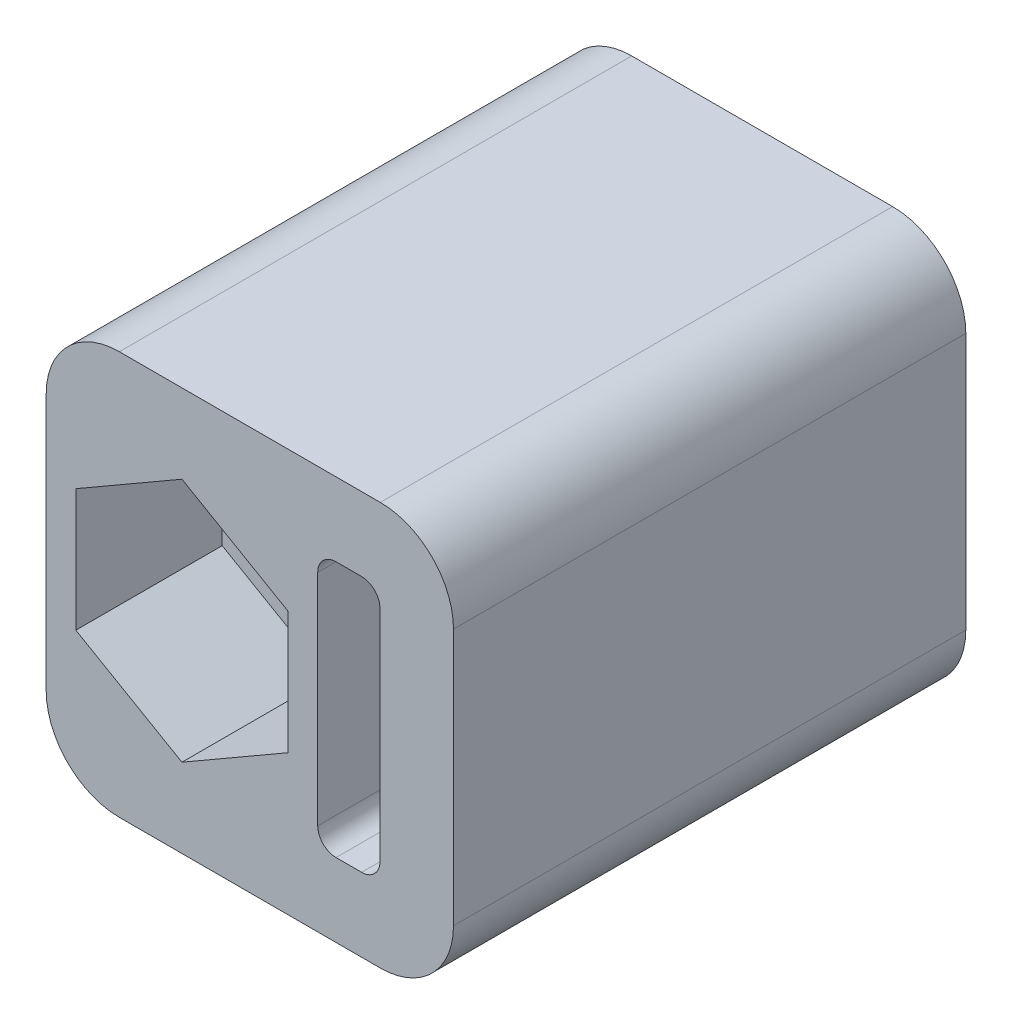
ISO-10303-21;
HEADER;
FILE_DESCRIPTION(('STEP AP214'),'2;1');
FILE_NAME('part.step','',(''),(''),'','','');
FILE_SCHEMA(('AUTOMOTIVE_DESIGN { 1 0 10303 214 1 1 1 1 }'));
ENDSEC;
DATA;
#1=APPLICATION_CONTEXT('core data for automotive mechanical design processes');
#2=APPLICATION_PROTOCOL_DEFINITION('international standard','automotive_design',2000,#1);
#3=PRODUCT_CONTEXT('',#1,'mechanical');
#4=PRODUCT('Part','Part','',(#3));
#5=PRODUCT_RELATED_PRODUCT_CATEGORY('part','',(#4));
#6=PRODUCT_DEFINITION_FORMATION('','',#4);
#7=PRODUCT_DEFINITION_CONTEXT('part definition',#1,'design');
#8=PRODUCT_DEFINITION('design','',#6,#7);
#9=PRODUCT_DEFINITION_SHAPE('','',#8);
#10=(LENGTH_UNIT() NAMED_UNIT(*) SI_UNIT(.MILLI.,.METRE.));
#11=(NAMED_UNIT(*) PLANE_ANGLE_UNIT() SI_UNIT($,.RADIAN.));
#12=(NAMED_UNIT(*) SI_UNIT($,.STERADIAN.) SOLID_ANGLE_UNIT());
#13=UNCERTAINTY_MEASURE_WITH_UNIT(LENGTH_MEASURE(1.E-05),#10,'distance_accuracy_value','');
#14=(GEOMETRIC_REPRESENTATION_CONTEXT(3) GLOBAL_UNCERTAINTY_ASSIGNED_CONTEXT((#13)) GLOBAL_UNIT_ASSIGNED_CONTEXT((#10,
#11,#12)) REPRESENTATION_CONTEXT('',''));
#15=CARTESIAN_POINT('',(0.,0.,0.));
#16=DIRECTION('',(0.,0.,1.));
#17=DIRECTION('',(1.,0.,0.));
#18=AXIS2_PLACEMENT_3D('',#15,#16,#17);
#19=CARTESIAN_POINT('',(0.,0.,14.));
#20=DIRECTION('',(0.,0.,-1.));
#21=DIRECTION('',(-1.,0.,0.));
#22=AXIS2_PLACEMENT_3D('',#19,#20,#21);
#23=CYLINDRICAL_SURFACE('',#22,1.70000000000001);
#24=CARTESIAN_POINT('',(0.,0.,0.));
#25=DIRECTION('',(0.,0.,1.));
#26=DIRECTION('',(1.,0.,0.));
#27=AXIS2_PLACEMENT_3D('',#24,#25,#26);
#28=CIRCLE('',#27,1.70000000000001);
#29=CARTESIAN_POINT('',(1.70000000000001,0.,0.));
#30=VERTEX_POINT('',#29);
#31=EDGE_CURVE('E241',#30,#30,#28,.T.);
#32=ORIENTED_EDGE('',*,*,#31,.F.);
#33=EDGE_LOOP('',(#32));
#34=FACE_BOUND('',#33,.T.);
#35=CARTESIAN_POINT('',(0.,0.,10.));
#36=DIRECTION('',(0.,0.,1.));
#37=DIRECTION('',(1.,0.,0.));
#38=AXIS2_PLACEMENT_3D('',#35,#36,#37);
#39=CIRCLE('',#38,1.70000000000001);
#40=CARTESIAN_POINT('',(1.70000000000001,0.,10.));
#41=VERTEX_POINT('',#40);
#42=EDGE_CURVE('E41',#41,#41,#39,.T.);
#43=ORIENTED_EDGE('',*,*,#42,.T.);
#44=EDGE_LOOP('',(#43));
#45=FACE_BOUND('',#44,.T.);
#46=ADVANCED_FACE('F37',(#34,#45),#23,.F.);
#47=CARTESIAN_POINT('',(-1.71000000000008,-3.50999999999999,14.));
#48=DIRECTION('',(0.,0.,-1.));
#49=DIRECTION('',(-1.,0.,0.));
#50=AXIS2_PLACEMENT_3D('',#47,#48,#49);
#51=PLANE('',#50);
#52=DIRECTION('',(-0.866025403784439,-0.5,0.));
#53=VECTOR('',#52,1.);
#54=CARTESIAN_POINT('',(0.,3.34863156129983,14.));
#55=LINE('',#54,#53);
#56=CARTESIAN_POINT('',(0.,3.34863156129983,14.));
#57=VERTEX_POINT('',#56);
#58=CARTESIAN_POINT('',(-2.9,1.67431578064992,14.));
#59=VERTEX_POINT('',#58);
#60=EDGE_CURVE('E222',#57,#59,#55,.T.);
#61=ORIENTED_EDGE('',*,*,#60,.F.);
#62=DIRECTION('',(-0.866025403784439,0.5,0.));
#63=VECTOR('',#62,1.);
#64=CARTESIAN_POINT('',(2.9,1.67431578064992,14.));
#65=LINE('',#64,#63);
#66=CARTESIAN_POINT('',(2.9,1.67431578064992,14.));
#67=VERTEX_POINT('',#66);
#68=EDGE_CURVE('E53',#67,#57,#65,.T.);
#69=ORIENTED_EDGE('',*,*,#68,.F.);
#70=DIRECTION('',(0.,1.,0.));
#71=VECTOR('',#70,1.);
#72=CARTESIAN_POINT('',(2.9,-1.67431578064992,14.));
#73=LINE('',#72,#71);
#74=CARTESIAN_POINT('',(2.9,-1.67431578064992,14.));
#75=VERTEX_POINT('',#74);
#76=EDGE_CURVE('E208',#75,#67,#73,.T.);
#77=ORIENTED_EDGE('',*,*,#76,.F.);
#78=DIRECTION('',(0.866025403784439,0.5,0.));
#79=VECTOR('',#78,1.);
#80=CARTESIAN_POINT('',(0.,-3.34863156129983,14.));
#81=LINE('',#80,#79);
#82=CARTESIAN_POINT('',(0.,-3.34863156129983,14.));
#83=VERTEX_POINT('',#82);
#84=EDGE_CURVE('E211',#83,#75,#81,.T.);
#85=ORIENTED_EDGE('',*,*,#84,.F.);
#86=DIRECTION('',(0.866025403784439,-0.5,0.));
#87=VECTOR('',#86,1.);
#88=CARTESIAN_POINT('',(-2.9,-1.67431578064992,14.));
#89=LINE('',#88,#87);
#90=CARTESIAN_POINT('',(-2.9,-1.67431578064992,14.));
#91=VERTEX_POINT('',#90);
#92=EDGE_CURVE('E227',#91,#83,#89,.T.);
#93=ORIENTED_EDGE('',*,*,#92,.F.);
#94=DIRECTION('',(0.,-1.,0.));
#95=VECTOR('',#94,1.);
#96=CARTESIAN_POINT('',(-2.9,1.67431578064992,14.));
#97=LINE('',#96,#95);
#98=EDGE_CURVE('E224',#59,#91,#97,.T.);
#99=ORIENTED_EDGE('',*,*,#98,.F.);
#100=EDGE_LOOP('',(#61,#69,#77,#85,#93,#99));
#101=FACE_BOUND('',#100,.T.);
#102=CARTESIAN_POINT('',(-1.71000000000008,-3.50999999999999,14.));
#103=DIRECTION('',(0.,0.,1.));
#104=DIRECTION('',(-1.,0.,0.));
#105=AXIS2_PLACEMENT_3D('',#102,#103,#104);
#106=CIRCLE('',#105,1.99999999999994);
#107=CARTESIAN_POINT('',(-3.71,-3.50999999999999,14.));
#108=VERTEX_POINT('',#107);
#109=CARTESIAN_POINT('',(-1.70999999999994,-5.50999999999995,14.));
#110=VERTEX_POINT('',#109);
#111=EDGE_CURVE('E302',#108,#110,#106,.T.);
#112=ORIENTED_EDGE('',*,*,#111,.T.);
#113=DIRECTION('',(1.,0.,0.));
#114=VECTOR('',#113,1.);
#115=CARTESIAN_POINT('',(5.41999999999862,-5.50999999999995,14.));
#116=LINE('',#115,#114);
#117=CARTESIAN_POINT('',(5.41999999999862,-5.50999999999995,14.));
#118=VERTEX_POINT('',#117);
#119=EDGE_CURVE('E305',#110,#118,#116,.T.);
#120=ORIENTED_EDGE('',*,*,#119,.T.);
#121=CARTESIAN_POINT('',(5.41999999999862,-3.50999999999996,14.));
#122=DIRECTION('',(0.,0.,1.));
#123=DIRECTION('',(-1.,0.,0.));
#124=AXIS2_PLACEMENT_3D('',#121,#122,#123);
#125=CIRCLE('',#124,1.99999999999999);
#126=CARTESIAN_POINT('',(7.41999999999861,-3.50999999999978,14.));
#127=VERTEX_POINT('',#126);
#128=EDGE_CURVE('E308',#118,#127,#125,.T.);
#129=ORIENTED_EDGE('',*,*,#128,.T.);
#130=DIRECTION('',(0.,1.,0.));
#131=VECTOR('',#130,1.);
#132=CARTESIAN_POINT('',(7.41999999999861,3.51000000000028,14.));
#133=LINE('',#132,#131);
#134=CARTESIAN_POINT('',(7.41999999999861,3.51000000000028,14.));
#135=VERTEX_POINT('',#134);
#136=EDGE_CURVE('E310',#127,#135,#133,.T.);
#137=ORIENTED_EDGE('',*,*,#136,.T.);
#138=CARTESIAN_POINT('',(5.41999999999865,3.5100000000001,14.));
#139=DIRECTION('',(0.,0.,1.));
#140=DIRECTION('',(-1.,0.,0.));
#141=AXIS2_PLACEMENT_3D('',#138,#139,#140);
#142=CIRCLE('',#141,1.99999999999997);
#143=CARTESIAN_POINT('',(5.4199999999983,5.51000000000006,14.));
#144=VERTEX_POINT('',#143);
#145=EDGE_CURVE('E312',#135,#144,#142,.T.);
#146=ORIENTED_EDGE('',*,*,#145,.T.);
#147=DIRECTION('',(-1.,0.,0.));
#148=VECTOR('',#147,1.);
#149=CARTESIAN_POINT('',(5.4199999999983,5.51000000000006,14.));
#150=LINE('',#149,#148);
#151=CARTESIAN_POINT('',(-1.71000000000006,5.51000000000006,14.));
#152=VERTEX_POINT('',#151);
#153=EDGE_CURVE('E314',#144,#152,#150,.T.);
#154=ORIENTED_EDGE('',*,*,#153,.T.);
#155=CARTESIAN_POINT('',(-1.70999999999993,3.51000000000001,14.));
#156=DIRECTION('',(0.,0.,1.));
#157=DIRECTION('',(1.,0.,0.));
#158=AXIS2_PLACEMENT_3D('',#155,#156,#157);
#159=CIRCLE('',#158,2.00000000000007);
#160=CARTESIAN_POINT('',(-3.70999999999999,3.51000000000001,14.));
#161=VERTEX_POINT('',#160);
#162=EDGE_CURVE('E316',#152,#161,#159,.T.);
#163=ORIENTED_EDGE('',*,*,#162,.T.);
#164=DIRECTION('',(0.,-1.,0.));
#165=VECTOR('',#164,1.);
#166=CARTESIAN_POINT('',(-3.71,3.51000000000001,14.));
#167=LINE('',#166,#165);
#168=EDGE_CURVE('E318',#161,#108,#167,.T.);
#169=ORIENTED_EDGE('',*,*,#168,.T.);
#170=EDGE_LOOP('',(#112,#120,#129,#137,#146,#154,#163,#169));
#171=FACE_BOUND('',#170,.T.);
#172=CARTESIAN_POINT('',(4.90999999999984,-3.,14.));
#173=DIRECTION('',(0.,0.,1.));
#174=DIRECTION('',(-1.,0.,0.));
#175=AXIS2_PLACEMENT_3D('',#172,#173,#174);
#176=CIRCLE('',#175,0.499999999999999);
#177=CARTESIAN_POINT('',(4.90999999999984,-3.5,14.));
#178=VERTEX_POINT('',#177);
#179=CARTESIAN_POINT('',(5.40999999999985,-3.,14.));
#180=VERTEX_POINT('',#179);
#181=EDGE_CURVE('E245',#178,#180,#176,.T.);
#182=ORIENTED_EDGE('',*,*,#181,.F.);
#183=DIRECTION('',(1.,0.,0.));
#184=VECTOR('',#183,1.);
#185=CARTESIAN_POINT('',(4.21000000000001,-3.5,14.));
#186=LINE('',#185,#184);
#187=CARTESIAN_POINT('',(4.21000000000001,-3.5,14.));
#188=VERTEX_POINT('',#187);
#189=EDGE_CURVE('E260',#188,#178,#186,.T.);
#190=ORIENTED_EDGE('',*,*,#189,.F.);
#191=CARTESIAN_POINT('',(4.21000000000001,-3.,14.));
#192=DIRECTION('',(0.,0.,1.));
#193=DIRECTION('',(1.,0.,0.));
#194=AXIS2_PLACEMENT_3D('',#191,#192,#193);
#195=CIRCLE('',#194,0.5);
#196=CARTESIAN_POINT('',(3.71,-3.,14.));
#197=VERTEX_POINT('',#196);
#198=EDGE_CURVE('E258',#197,#188,#195,.T.);
#199=ORIENTED_EDGE('',*,*,#198,.F.);
#200=DIRECTION('',(0.,-1.,0.));
#201=VECTOR('',#200,1.);
#202=CARTESIAN_POINT('',(3.71,3.,14.));
#203=LINE('',#202,#201);
#204=CARTESIAN_POINT('',(3.71,3.,14.));
#205=VERTEX_POINT('',#204);
#206=EDGE_CURVE('E256',#205,#197,#203,.T.);
#207=ORIENTED_EDGE('',*,*,#206,.F.);
#208=CARTESIAN_POINT('',(4.21000000000001,3.,14.));
#209=DIRECTION('',(0.,0.,1.));
#210=DIRECTION('',(-1.,0.,0.));
#211=AXIS2_PLACEMENT_3D('',#208,#209,#210);
#212=CIRCLE('',#211,0.5);
#213=CARTESIAN_POINT('',(4.21000000000001,3.5,14.));
#214=VERTEX_POINT('',#213);
#215=EDGE_CURVE('E254',#214,#205,#212,.T.);
#216=ORIENTED_EDGE('',*,*,#215,.F.);
#217=DIRECTION('',(-1.,0.,0.));
#218=VECTOR('',#217,1.);
#219=CARTESIAN_POINT('',(4.21000000000001,3.5,14.));
#220=LINE('',#219,#218);
#221=CARTESIAN_POINT('',(4.90999999999984,3.50000000000001,14.));
#222=VERTEX_POINT('',#221);
#223=EDGE_CURVE('E252',#222,#214,#220,.T.);
#224=ORIENTED_EDGE('',*,*,#223,.F.);
#225=CARTESIAN_POINT('',(4.90999999999985,3.00000000000001,14.));
#226=DIRECTION('',(0.,0.,1.));
#227=DIRECTION('',(-1.,0.,0.));
#228=AXIS2_PLACEMENT_3D('',#225,#226,#227);
#229=CIRCLE('',#228,0.499999999999997);
#230=CARTESIAN_POINT('',(5.40999999999985,3.00000000000001,14.));
#231=VERTEX_POINT('',#230);
#232=EDGE_CURVE('E250',#231,#222,#229,.T.);
#233=ORIENTED_EDGE('',*,*,#232,.F.);
#234=DIRECTION('',(0.,1.,0.));
#235=VECTOR('',#234,1.);
#236=CARTESIAN_POINT('',(5.40999999999985,3.00000000000001,14.));
#237=LINE('',#236,#235);
#238=EDGE_CURVE('E247',#180,#231,#237,.T.);
#239=ORIENTED_EDGE('',*,*,#238,.F.);
#240=EDGE_LOOP('',(#182,#190,#199,#207,#216,#224,#233,#239));
#241=FACE_BOUND('',#240,.T.);
#242=ADVANCED_FACE('F378',(#101,#171,#241),#51,.F.);
#243=CARTESIAN_POINT('',(-1.71000000000008,-3.50999999999999,0.));
#244=DIRECTION('',(0.,0.,-1.));
#245=DIRECTION('',(-1.,0.,0.));
#246=AXIS2_PLACEMENT_3D('',#243,#244,#245);
#247=PLANE('',#246);
#248=DIRECTION('',(1.,0.,0.));
#249=VECTOR('',#248,1.);
#250=CARTESIAN_POINT('',(4.21000000000001,-3.5,0.));
#251=LINE('',#250,#249);
#252=CARTESIAN_POINT('',(4.21000000000001,-3.5,0.));
#253=VERTEX_POINT('',#252);
#254=CARTESIAN_POINT('',(4.90999999999984,-3.5,0.));
#255=VERTEX_POINT('',#254);
#256=EDGE_CURVE('E248',#253,#255,#251,.T.);
#257=ORIENTED_EDGE('',*,*,#256,.T.);
#258=CARTESIAN_POINT('',(4.90999999999984,-3.,0.));
#259=DIRECTION('',(0.,0.,1.));
#260=DIRECTION('',(-1.,0.,0.));
#261=AXIS2_PLACEMENT_3D('',#258,#259,#260);
#262=CIRCLE('',#261,0.499999999999999);
#263=CARTESIAN_POINT('',(5.40999999999985,-3.,0.));
#264=VERTEX_POINT('',#263);
#265=EDGE_CURVE('E244',#255,#264,#262,.T.);
#266=ORIENTED_EDGE('',*,*,#265,.T.);
#267=DIRECTION('',(0.,1.,0.));
#268=VECTOR('',#267,1.);
#269=CARTESIAN_POINT('',(5.40999999999985,3.00000000000001,0.));
#270=LINE('',#269,#268);
#271=CARTESIAN_POINT('',(5.40999999999985,3.00000000000001,0.));
#272=VERTEX_POINT('',#271);
#273=EDGE_CURVE('E265',#264,#272,#270,.T.);
#274=ORIENTED_EDGE('',*,*,#273,.T.);
#275=CARTESIAN_POINT('',(4.90999999999985,3.00000000000001,0.));
#276=DIRECTION('',(0.,0.,1.));
#277=DIRECTION('',(-1.,0.,0.));
#278=AXIS2_PLACEMENT_3D('',#275,#276,#277);
#279=CIRCLE('',#278,0.499999999999997);
#280=CARTESIAN_POINT('',(4.90999999999984,3.50000000000001,0.));
#281=VERTEX_POINT('',#280);
#282=EDGE_CURVE('E268',#272,#281,#279,.T.);
#283=ORIENTED_EDGE('',*,*,#282,.T.);
#284=DIRECTION('',(-1.,0.,0.));
#285=VECTOR('',#284,1.);
#286=CARTESIAN_POINT('',(4.21000000000001,3.5,0.));
#287=LINE('',#286,#285);
#288=CARTESIAN_POINT('',(4.21000000000001,3.5,0.));
#289=VERTEX_POINT('',#288);
#290=EDGE_CURVE('E271',#281,#289,#287,.T.);
#291=ORIENTED_EDGE('',*,*,#290,.T.);
#292=CARTESIAN_POINT('',(4.21000000000001,3.,0.));
#293=DIRECTION('',(0.,0.,1.));
#294=DIRECTION('',(-1.,0.,0.));
#295=AXIS2_PLACEMENT_3D('',#292,#293,#294);
#296=CIRCLE('',#295,0.5);
#297=CARTESIAN_POINT('',(3.71,3.,0.));
#298=VERTEX_POINT('',#297);
#299=EDGE_CURVE('E274',#289,#298,#296,.T.);
#300=ORIENTED_EDGE('',*,*,#299,.T.);
#301=DIRECTION('',(0.,-1.,0.));
#302=VECTOR('',#301,1.);
#303=CARTESIAN_POINT('',(3.71,3.,0.));
#304=LINE('',#303,#302);
#305=CARTESIAN_POINT('',(3.71,-3.,0.));
#306=VERTEX_POINT('',#305);
#307=EDGE_CURVE('E277',#298,#306,#304,.T.);
#308=ORIENTED_EDGE('',*,*,#307,.T.);
#309=CARTESIAN_POINT('',(4.21000000000001,-3.,0.));
#310=DIRECTION('',(0.,0.,1.));
#311=DIRECTION('',(1.,0.,0.));
#312=AXIS2_PLACEMENT_3D('',#309,#310,#311);
#313=CIRCLE('',#312,0.5);
#314=EDGE_CURVE('E280',#306,#253,#313,.T.);
#315=ORIENTED_EDGE('',*,*,#314,.T.);
#316=EDGE_LOOP('',(#257,#266,#274,#283,#291,#300,#308,#315));
#317=FACE_BOUND('',#316,.T.);
#318=CARTESIAN_POINT('',(-1.71000000000008,-3.50999999999999,0.));
#319=DIRECTION('',(0.,0.,1.));
#320=DIRECTION('',(-1.,0.,0.));
#321=AXIS2_PLACEMENT_3D('',#318,#319,#320);
#322=CIRCLE('',#321,1.99999999999994);
#323=CARTESIAN_POINT('',(-3.71,-3.50999999999999,0.));
#324=VERTEX_POINT('',#323);
#325=CARTESIAN_POINT('',(-1.70999999999994,-5.50999999999995,0.));
#326=VERTEX_POINT('',#325);
#327=EDGE_CURVE('E301',#324,#326,#322,.T.);
#328=ORIENTED_EDGE('',*,*,#327,.F.);
#329=DIRECTION('',(0.,-1.,0.));
#330=VECTOR('',#329,1.);
#331=CARTESIAN_POINT('',(-3.71,3.51000000000001,0.));
#332=LINE('',#331,#330);
#333=CARTESIAN_POINT('',(-3.70999999999999,3.51000000000001,0.));
#334=VERTEX_POINT('',#333);
#335=EDGE_CURVE('E306',#334,#324,#332,.T.);
#336=ORIENTED_EDGE('',*,*,#335,.F.);
#337=CARTESIAN_POINT('',(-1.70999999999993,3.51000000000001,0.));
#338=DIRECTION('',(0.,0.,1.));
#339=DIRECTION('',(1.,0.,0.));
#340=AXIS2_PLACEMENT_3D('',#337,#338,#339);
#341=CIRCLE('',#340,2.00000000000007);
#342=CARTESIAN_POINT('',(-1.71000000000006,5.51000000000006,0.));
#343=VERTEX_POINT('',#342);
#344=EDGE_CURVE('E333',#343,#334,#341,.T.);
#345=ORIENTED_EDGE('',*,*,#344,.F.);
#346=DIRECTION('',(-1.,0.,0.));
#347=VECTOR('',#346,1.);
#348=CARTESIAN_POINT('',(5.4199999999983,5.51000000000006,0.));
#349=LINE('',#348,#347);
#350=CARTESIAN_POINT('',(5.4199999999983,5.51000000000006,0.));
#351=VERTEX_POINT('',#350);
#352=EDGE_CURVE('E331',#351,#343,#349,.T.);
#353=ORIENTED_EDGE('',*,*,#352,.F.);
#354=CARTESIAN_POINT('',(5.41999999999865,3.5100000000001,0.));
#355=DIRECTION('',(0.,0.,1.));
#356=DIRECTION('',(-1.,0.,0.));
#357=AXIS2_PLACEMENT_3D('',#354,#355,#356);
#358=CIRCLE('',#357,1.99999999999997);
#359=CARTESIAN_POINT('',(7.41999999999861,3.51000000000028,0.));
#360=VERTEX_POINT('',#359);
#361=EDGE_CURVE('E329',#360,#351,#358,.T.);
#362=ORIENTED_EDGE('',*,*,#361,.F.);
#363=DIRECTION('',(0.,1.,0.));
#364=VECTOR('',#363,1.);
#365=CARTESIAN_POINT('',(7.41999999999861,3.51000000000028,0.));
#366=LINE('',#365,#364);
#367=CARTESIAN_POINT('',(7.41999999999861,-3.50999999999978,0.));
#368=VERTEX_POINT('',#367);
#369=EDGE_CURVE('E327',#368,#360,#366,.T.);
#370=ORIENTED_EDGE('',*,*,#369,.F.);
#371=CARTESIAN_POINT('',(5.41999999999862,-3.50999999999996,0.));
#372=DIRECTION('',(0.,0.,1.));
#373=DIRECTION('',(-1.,0.,0.));
#374=AXIS2_PLACEMENT_3D('',#371,#372,#373);
#375=CIRCLE('',#374,1.99999999999999);
#376=CARTESIAN_POINT('',(5.41999999999862,-5.50999999999995,0.));
#377=VERTEX_POINT('',#376);
#378=EDGE_CURVE('E325',#377,#368,#375,.T.);
#379=ORIENTED_EDGE('',*,*,#378,.F.);
#380=DIRECTION('',(1.,0.,0.));
#381=VECTOR('',#380,1.);
#382=CARTESIAN_POINT('',(5.41999999999862,-5.50999999999995,0.));
#383=LINE('',#382,#381);
#384=EDGE_CURVE('E323',#326,#377,#383,.T.);
#385=ORIENTED_EDGE('',*,*,#384,.F.);
#386=EDGE_LOOP('',(#328,#336,#345,#353,#362,#370,#379,#385));
#387=FACE_BOUND('',#386,.T.);
#388=ORIENTED_EDGE('',*,*,#31,.T.);
#389=EDGE_LOOP('',(#388));
#390=FACE_BOUND('',#389,.T.);
#391=ADVANCED_FACE('F364',(#317,#387,#390),#247,.T.);
#392=CARTESIAN_POINT('',(-1.71000000000008,-3.50999999999999,14.));
#393=DIRECTION('',(0.,0.,-1.));
#394=DIRECTION('',(-1.,0.,0.));
#395=AXIS2_PLACEMENT_3D('',#392,#393,#394);
#396=CYLINDRICAL_SURFACE('',#395,1.99999999999994);
#397=ORIENTED_EDGE('',*,*,#327,.T.);
#398=DIRECTION('',(0.,0.,-1.));
#399=VECTOR('',#398,1.);
#400=CARTESIAN_POINT('',(-1.70999999999994,-5.50999999999995,14.));
#401=LINE('',#400,#399);
#402=EDGE_CURVE('E11',#110,#326,#401,.T.);
#403=ORIENTED_EDGE('',*,*,#402,.F.);
#404=ORIENTED_EDGE('',*,*,#111,.F.);
#405=DIRECTION('',(0.,0.,-1.));
#406=VECTOR('',#405,1.);
#407=CARTESIAN_POINT('',(-3.71,-3.50999999999999,14.));
#408=LINE('',#407,#406);
#409=EDGE_CURVE('E320',#108,#324,#408,.T.);
#410=ORIENTED_EDGE('',*,*,#409,.T.);
#411=EDGE_LOOP('',(#397,#403,#404,#410));
#412=FACE_BOUND('',#411,.T.);
#413=ADVANCED_FACE('F39',(#412),#396,.T.);
#414=CARTESIAN_POINT('',(5.41999999999862,-5.50999999999995,14.));
#415=DIRECTION('',(0.,1.,0.));
#416=DIRECTION('',(0.,0.,1.));
#417=AXIS2_PLACEMENT_3D('',#414,#415,#416);
#418=PLANE('',#417);
#419=ORIENTED_EDGE('',*,*,#384,.T.);
#420=DIRECTION('',(0.,0.,-1.));
#421=VECTOR('',#420,1.);
#422=CARTESIAN_POINT('',(5.41999999999862,-5.50999999999995,14.));
#423=LINE('',#422,#421);
#424=EDGE_CURVE('E46',#118,#377,#423,.T.);
#425=ORIENTED_EDGE('',*,*,#424,.F.);
#426=ORIENTED_EDGE('',*,*,#119,.F.);
#427=ORIENTED_EDGE('',*,*,#402,.T.);
#428=EDGE_LOOP('',(#419,#425,#426,#427));
#429=FACE_BOUND('',#428,.T.);
#430=ADVANCED_FACE('F383',(#429),#418,.F.);
#431=CARTESIAN_POINT('',(5.41999999999862,-3.50999999999996,14.));
#432=DIRECTION('',(0.,0.,-1.));
#433=DIRECTION('',(-1.,0.,0.));
#434=AXIS2_PLACEMENT_3D('',#431,#432,#433);
#435=CYLINDRICAL_SURFACE('',#434,1.99999999999999);
#436=ORIENTED_EDGE('',*,*,#378,.T.);
#437=DIRECTION('',(0.,0.,-1.));
#438=VECTOR('',#437,1.);
#439=CARTESIAN_POINT('',(7.41999999999861,-3.50999999999978,14.));
#440=LINE('',#439,#438);
#441=EDGE_CURVE('E350',#127,#368,#440,.T.);
#442=ORIENTED_EDGE('',*,*,#441,.F.);
#443=ORIENTED_EDGE('',*,*,#128,.F.);
#444=ORIENTED_EDGE('',*,*,#424,.T.);
#445=EDGE_LOOP('',(#436,#442,#443,#444));
#446=FACE_BOUND('',#445,.T.);
#447=ADVANCED_FACE('F358',(#446),#435,.T.);
#448=CARTESIAN_POINT('',(7.41999999999861,3.51000000000028,14.));
#449=DIRECTION('',(-1.,0.,0.));
#450=DIRECTION('',(0.,0.,1.));
#451=AXIS2_PLACEMENT_3D('',#448,#449,#450);
#452=PLANE('',#451);
#453=ORIENTED_EDGE('',*,*,#369,.T.);
#454=DIRECTION('',(0.,0.,-1.));
#455=VECTOR('',#454,1.);
#456=CARTESIAN_POINT('',(7.41999999999861,3.51000000000028,14.));
#457=LINE('',#456,#455);
#458=EDGE_CURVE('E347',#135,#360,#457,.T.);
#459=ORIENTED_EDGE('',*,*,#458,.F.);
#460=ORIENTED_EDGE('',*,*,#136,.F.);
#461=ORIENTED_EDGE('',*,*,#441,.T.);
#462=EDGE_LOOP('',(#453,#459,#460,#461));
#463=FACE_BOUND('',#462,.T.);
#464=ADVANCED_FACE('F370',(#463),#452,.F.);
#465=CARTESIAN_POINT('',(5.41999999999865,3.5100000000001,14.));
#466=DIRECTION('',(0.,0.,-1.));
#467=DIRECTION('',(-1.,0.,0.));
#468=AXIS2_PLACEMENT_3D('',#465,#466,#467);
#469=CYLINDRICAL_SURFACE('',#468,1.99999999999997);
#470=ORIENTED_EDGE('',*,*,#361,.T.);
#471=DIRECTION('',(0.,0.,-1.));
#472=VECTOR('',#471,1.);
#473=CARTESIAN_POINT('',(5.4199999999983,5.51000000000006,14.));
#474=LINE('',#473,#472);
#475=EDGE_CURVE('E344',#144,#351,#474,.T.);
#476=ORIENTED_EDGE('',*,*,#475,.F.);
#477=ORIENTED_EDGE('',*,*,#145,.F.);
#478=ORIENTED_EDGE('',*,*,#458,.T.);
#479=EDGE_LOOP('',(#470,#476,#477,#478));
#480=FACE_BOUND('',#479,.T.);
#481=ADVANCED_FACE('F374',(#480),#469,.T.);
#482=CARTESIAN_POINT('',(5.4199999999983,5.51000000000006,14.));
#483=DIRECTION('',(0.,-1.,0.));
#484=DIRECTION('',(0.,0.,-1.));
#485=AXIS2_PLACEMENT_3D('',#482,#483,#484);
#486=PLANE('',#485);
#487=ORIENTED_EDGE('',*,*,#352,.T.);
#488=DIRECTION('',(0.,0.,-1.));
#489=VECTOR('',#488,1.);
#490=CARTESIAN_POINT('',(-1.71000000000006,5.51000000000006,14.));
#491=LINE('',#490,#489);
#492=EDGE_CURVE('E341',#152,#343,#491,.T.);
#493=ORIENTED_EDGE('',*,*,#492,.F.);
#494=ORIENTED_EDGE('',*,*,#153,.F.);
#495=ORIENTED_EDGE('',*,*,#475,.T.);
#496=EDGE_LOOP('',(#487,#493,#494,#495));
#497=FACE_BOUND('',#496,.T.);
#498=ADVANCED_FACE('F396',(#497),#486,.F.);
#499=CARTESIAN_POINT('',(-1.70999999999993,3.51000000000001,14.));
#500=DIRECTION('',(0.,0.,-1.));
#501=DIRECTION('',(-1.,0.,0.));
#502=AXIS2_PLACEMENT_3D('',#499,#500,#501);
#503=CYLINDRICAL_SURFACE('',#502,2.00000000000007);
#504=ORIENTED_EDGE('',*,*,#344,.T.);
#505=DIRECTION('',(0.,0.,-1.));
#506=VECTOR('',#505,1.);
#507=CARTESIAN_POINT('',(-3.70999999999999,3.51000000000001,14.));
#508=LINE('',#507,#506);
#509=EDGE_CURVE('E338',#161,#334,#508,.T.);
#510=ORIENTED_EDGE('',*,*,#509,.F.);
#511=ORIENTED_EDGE('',*,*,#162,.F.);
#512=ORIENTED_EDGE('',*,*,#492,.T.);
#513=EDGE_LOOP('',(#504,#510,#511,#512));
#514=FACE_BOUND('',#513,.T.);
#515=ADVANCED_FACE('F394',(#514),#503,.T.);
#516=CARTESIAN_POINT('',(-3.71,3.51000000000001,14.));
#517=DIRECTION('',(1.,0.,0.));
#518=DIRECTION('',(0.,0.,-1.));
#519=AXIS2_PLACEMENT_3D('',#516,#517,#518);
#520=PLANE('',#519);
#521=ORIENTED_EDGE('',*,*,#335,.T.);
#522=ORIENTED_EDGE('',*,*,#409,.F.);
#523=ORIENTED_EDGE('',*,*,#168,.F.);
#524=ORIENTED_EDGE('',*,*,#509,.T.);
#525=EDGE_LOOP('',(#521,#522,#523,#524));
#526=FACE_BOUND('',#525,.T.);
#527=ADVANCED_FACE('F389',(#526),#520,.F.);
#528=CARTESIAN_POINT('',(4.90999999999984,-3.,14.));
#529=DIRECTION('',(0.,0.,-1.));
#530=DIRECTION('',(-1.,0.,0.));
#531=AXIS2_PLACEMENT_3D('',#528,#529,#530);
#532=CYLINDRICAL_SURFACE('',#531,0.499999999999999);
#533=ORIENTED_EDGE('',*,*,#265,.F.);
#534=DIRECTION('',(0.,0.,-1.));
#535=VECTOR('',#534,1.);
#536=CARTESIAN_POINT('',(4.90999999999984,-3.5,14.));
#537=LINE('',#536,#535);
#538=EDGE_CURVE('E262',#178,#255,#537,.T.);
#539=ORIENTED_EDGE('',*,*,#538,.F.);
#540=ORIENTED_EDGE('',*,*,#181,.T.);
#541=DIRECTION('',(0.,0.,-1.));
#542=VECTOR('',#541,1.);
#543=CARTESIAN_POINT('',(5.40999999999985,-3.,14.));
#544=LINE('',#543,#542);
#545=EDGE_CURVE('E298',#180,#264,#544,.T.);
#546=ORIENTED_EDGE('',*,*,#545,.T.);
#547=EDGE_LOOP('',(#533,#539,#540,#546));
#548=FACE_BOUND('',#547,.T.);
#549=ADVANCED_FACE('F444',(#548),#532,.F.);
#550=CARTESIAN_POINT('',(5.40999999999985,3.00000000000001,14.));
#551=DIRECTION('',(-1.,0.,0.));
#552=DIRECTION('',(0.,0.,1.));
#553=AXIS2_PLACEMENT_3D('',#550,#551,#552);
#554=PLANE('',#553);
#555=ORIENTED_EDGE('',*,*,#273,.F.);
#556=ORIENTED_EDGE('',*,*,#545,.F.);
#557=ORIENTED_EDGE('',*,*,#238,.T.);
#558=DIRECTION('',(0.,0.,-1.));
#559=VECTOR('',#558,1.);
#560=CARTESIAN_POINT('',(5.40999999999985,3.00000000000001,14.));
#561=LINE('',#560,#559);
#562=EDGE_CURVE('E296',#231,#272,#561,.T.);
#563=ORIENTED_EDGE('',*,*,#562,.T.);
#564=EDGE_LOOP('',(#555,#556,#557,#563));
#565=FACE_BOUND('',#564,.T.);
#566=ADVANCED_FACE('F440',(#565),#554,.T.);
#567=CARTESIAN_POINT('',(4.90999999999985,3.00000000000001,14.));
#568=DIRECTION('',(0.,0.,-1.));
#569=DIRECTION('',(-1.,0.,0.));
#570=AXIS2_PLACEMENT_3D('',#567,#568,#569);
#571=CYLINDRICAL_SURFACE('',#570,0.499999999999997);
#572=ORIENTED_EDGE('',*,*,#282,.F.);
#573=ORIENTED_EDGE('',*,*,#562,.F.);
#574=ORIENTED_EDGE('',*,*,#232,.T.);
#575=DIRECTION('',(0.,0.,-1.));
#576=VECTOR('',#575,1.);
#577=CARTESIAN_POINT('',(4.90999999999984,3.50000000000001,14.));
#578=LINE('',#577,#576);
#579=EDGE_CURVE('E294',#222,#281,#578,.T.);
#580=ORIENTED_EDGE('',*,*,#579,.T.);
#581=EDGE_LOOP('',(#572,#573,#574,#580));
#582=FACE_BOUND('',#581,.T.);
#583=ADVANCED_FACE('F436',(#582),#571,.F.);
#584=CARTESIAN_POINT('',(4.21000000000001,3.5,14.));
#585=DIRECTION('',(0.,-1.,0.));
#586=DIRECTION('',(0.,0.,-1.));
#587=AXIS2_PLACEMENT_3D('',#584,#585,#586);
#588=PLANE('',#587);
#589=ORIENTED_EDGE('',*,*,#290,.F.);
#590=ORIENTED_EDGE('',*,*,#579,.F.);
#591=ORIENTED_EDGE('',*,*,#223,.T.);
#592=DIRECTION('',(0.,0.,-1.));
#593=VECTOR('',#592,1.);
#594=CARTESIAN_POINT('',(4.21000000000001,3.5,14.));
#595=LINE('',#594,#593);
#596=EDGE_CURVE('E292',#214,#289,#595,.T.);
#597=ORIENTED_EDGE('',*,*,#596,.T.);
#598=EDGE_LOOP('',(#589,#590,#591,#597));
#599=FACE_BOUND('',#598,.T.);
#600=ADVANCED_FACE('F432',(#599),#588,.T.);
#601=CARTESIAN_POINT('',(4.21000000000001,3.,14.));
#602=DIRECTION('',(0.,0.,-1.));
#603=DIRECTION('',(-1.,0.,0.));
#604=AXIS2_PLACEMENT_3D('',#601,#602,#603);
#605=CYLINDRICAL_SURFACE('',#604,0.5);
#606=ORIENTED_EDGE('',*,*,#299,.F.);
#607=ORIENTED_EDGE('',*,*,#596,.F.);
#608=ORIENTED_EDGE('',*,*,#215,.T.);
#609=DIRECTION('',(0.,0.,-1.));
#610=VECTOR('',#609,1.);
#611=CARTESIAN_POINT('',(3.71,3.,14.));
#612=LINE('',#611,#610);
#613=EDGE_CURVE('E290',#205,#298,#612,.T.);
#614=ORIENTED_EDGE('',*,*,#613,.T.);
#615=EDGE_LOOP('',(#606,#607,#608,#614));
#616=FACE_BOUND('',#615,.T.);
#617=ADVANCED_FACE('F428',(#616),#605,.F.);
#618=CARTESIAN_POINT('',(3.71,3.,14.));
#619=DIRECTION('',(1.,0.,0.));
#620=DIRECTION('',(0.,0.,-1.));
#621=AXIS2_PLACEMENT_3D('',#618,#619,#620);
#622=PLANE('',#621);
#623=ORIENTED_EDGE('',*,*,#307,.F.);
#624=ORIENTED_EDGE('',*,*,#613,.F.);
#625=ORIENTED_EDGE('',*,*,#206,.T.);
#626=DIRECTION('',(0.,0.,-1.));
#627=VECTOR('',#626,1.);
#628=CARTESIAN_POINT('',(3.71,-3.,14.));
#629=LINE('',#628,#627);
#630=EDGE_CURVE('E288',#197,#306,#629,.T.);
#631=ORIENTED_EDGE('',*,*,#630,.T.);
#632=EDGE_LOOP('',(#623,#624,#625,#631));
#633=FACE_BOUND('',#632,.T.);
#634=ADVANCED_FACE('F424',(#633),#622,.T.);
#635=CARTESIAN_POINT('',(4.21000000000001,-3.,14.));
#636=DIRECTION('',(0.,0.,-1.));
#637=DIRECTION('',(-1.,0.,0.));
#638=AXIS2_PLACEMENT_3D('',#635,#636,#637);
#639=CYLINDRICAL_SURFACE('',#638,0.5);
#640=ORIENTED_EDGE('',*,*,#314,.F.);
#641=ORIENTED_EDGE('',*,*,#630,.F.);
#642=ORIENTED_EDGE('',*,*,#198,.T.);
#643=DIRECTION('',(0.,0.,-1.));
#644=VECTOR('',#643,1.);
#645=CARTESIAN_POINT('',(4.21000000000001,-3.5,14.));
#646=LINE('',#645,#644);
#647=EDGE_CURVE('E61',#188,#253,#646,.T.);
#648=ORIENTED_EDGE('',*,*,#647,.T.);
#649=EDGE_LOOP('',(#640,#641,#642,#648));
#650=FACE_BOUND('',#649,.T.);
#651=ADVANCED_FACE('F421',(#650),#639,.F.);
#652=CARTESIAN_POINT('',(4.21000000000001,-3.5,14.));
#653=DIRECTION('',(0.,1.,0.));
#654=DIRECTION('',(0.,0.,1.));
#655=AXIS2_PLACEMENT_3D('',#652,#653,#654);
#656=PLANE('',#655);
#657=ORIENTED_EDGE('',*,*,#256,.F.);
#658=ORIENTED_EDGE('',*,*,#647,.F.);
#659=ORIENTED_EDGE('',*,*,#189,.T.);
#660=ORIENTED_EDGE('',*,*,#538,.T.);
#661=EDGE_LOOP('',(#657,#658,#659,#660));
#662=FACE_BOUND('',#661,.T.);
#663=ADVANCED_FACE('F418',(#662),#656,.T.);
#664=CARTESIAN_POINT('',(2.9,1.67431578064992,10.));
#665=DIRECTION('',(0.5,0.866025403784439,0.));
#666=DIRECTION('',(-0.866025403784439,0.5,0.));
#667=AXIS2_PLACEMENT_3D('',#664,#665,#666);
#668=PLANE('',#667);
#669=ORIENTED_EDGE('',*,*,#68,.T.);
#670=DIRECTION('',(0.,0.,1.));
#671=VECTOR('',#670,1.);
#672=CARTESIAN_POINT('',(0.,3.34863156129983,10.));
#673=LINE('',#672,#671);
#674=CARTESIAN_POINT('',(0.,3.34863156129983,10.));
#675=VERTEX_POINT('',#674);
#676=EDGE_CURVE('E185',#675,#57,#673,.T.);
#677=ORIENTED_EDGE('',*,*,#676,.F.);
#678=DIRECTION('',(-0.866025403784439,0.5,0.));
#679=VECTOR('',#678,1.);
#680=CARTESIAN_POINT('',(2.9,1.67431578064992,10.));
#681=LINE('',#680,#679);
#682=CARTESIAN_POINT('',(2.9,1.67431578064992,10.));
#683=VERTEX_POINT('',#682);
#684=EDGE_CURVE('E189',#683,#675,#681,.T.);
#685=ORIENTED_EDGE('',*,*,#684,.F.);
#686=DIRECTION('',(0.,0.,1.));
#687=VECTOR('',#686,1.);
#688=CARTESIAN_POINT('',(2.9,1.67431578064992,10.));
#689=LINE('',#688,#687);
#690=EDGE_CURVE('E232',#683,#67,#689,.T.);
#691=ORIENTED_EDGE('',*,*,#690,.T.);
#692=EDGE_LOOP('',(#669,#677,#685,#691));
#693=FACE_BOUND('',#692,.T.);
#694=ADVANCED_FACE('F187',(#693),#668,.F.);
#695=CARTESIAN_POINT('',(2.9,-1.67431578064992,10.));
#696=DIRECTION('',(1.,0.,0.));
#697=DIRECTION('',(0.,0.,-1.));
#698=AXIS2_PLACEMENT_3D('',#695,#696,#697);
#699=PLANE('',#698);
#700=ORIENTED_EDGE('',*,*,#76,.T.);
#701=ORIENTED_EDGE('',*,*,#690,.F.);
#702=DIRECTION('',(0.,1.,0.));
#703=VECTOR('',#702,1.);
#704=CARTESIAN_POINT('',(2.9,-1.67431578064992,10.));
#705=LINE('',#704,#703);
#706=CARTESIAN_POINT('',(2.9,-1.67431578064992,10.));
#707=VERTEX_POINT('',#706);
#708=EDGE_CURVE('E195',#707,#683,#705,.T.);
#709=ORIENTED_EDGE('',*,*,#708,.F.);
#710=DIRECTION('',(0.,0.,1.));
#711=VECTOR('',#710,1.);
#712=CARTESIAN_POINT('',(2.9,-1.67431578064992,10.));
#713=LINE('',#712,#711);
#714=EDGE_CURVE('E234',#707,#75,#713,.T.);
#715=ORIENTED_EDGE('',*,*,#714,.T.);
#716=EDGE_LOOP('',(#700,#701,#709,#715));
#717=FACE_BOUND('',#716,.T.);
#718=ADVANCED_FACE('F495',(#717),#699,.F.);
#719=CARTESIAN_POINT('',(0.,-3.34863156129983,10.));
#720=DIRECTION('',(0.5,-0.866025403784439,0.));
#721=DIRECTION('',(0.866025403784439,0.5,0.));
#722=AXIS2_PLACEMENT_3D('',#719,#720,#721);
#723=PLANE('',#722);
#724=ORIENTED_EDGE('',*,*,#84,.T.);
#725=ORIENTED_EDGE('',*,*,#714,.F.);
#726=DIRECTION('',(0.866025403784439,0.5,0.));
#727=VECTOR('',#726,1.);
#728=CARTESIAN_POINT('',(0.,-3.34863156129983,10.));
#729=LINE('',#728,#727);
#730=CARTESIAN_POINT('',(0.,-3.34863156129983,10.));
#731=VERTEX_POINT('',#730);
#732=EDGE_CURVE('E218',#731,#707,#729,.T.);
#733=ORIENTED_EDGE('',*,*,#732,.F.);
#734=DIRECTION('',(0.,0.,1.));
#735=VECTOR('',#734,1.);
#736=CARTESIAN_POINT('',(0.,-3.34863156129983,10.));
#737=LINE('',#736,#735);
#738=EDGE_CURVE('E236',#731,#83,#737,.T.);
#739=ORIENTED_EDGE('',*,*,#738,.T.);
#740=EDGE_LOOP('',(#724,#725,#733,#739));
#741=FACE_BOUND('',#740,.T.);
#742=ADVANCED_FACE('F502',(#741),#723,.F.);
#743=CARTESIAN_POINT('',(-2.9,-1.67431578064992,10.));
#744=DIRECTION('',(-0.5,-0.866025403784439,0.));
#745=DIRECTION('',(0.866025403784439,-0.5,0.));
#746=AXIS2_PLACEMENT_3D('',#743,#744,#745);
#747=PLANE('',#746);
#748=ORIENTED_EDGE('',*,*,#92,.T.);
#749=ORIENTED_EDGE('',*,*,#738,.F.);
#750=DIRECTION('',(0.866025403784439,-0.5,0.));
#751=VECTOR('',#750,1.);
#752=CARTESIAN_POINT('',(-2.9,-1.67431578064992,10.));
#753=LINE('',#752,#751);
#754=CARTESIAN_POINT('',(-2.9,-1.67431578064992,10.));
#755=VERTEX_POINT('',#754);
#756=EDGE_CURVE('E215',#755,#731,#753,.T.);
#757=ORIENTED_EDGE('',*,*,#756,.F.);
#758=DIRECTION('',(0.,0.,1.));
#759=VECTOR('',#758,1.);
#760=CARTESIAN_POINT('',(-2.9,-1.67431578064992,10.));
#761=LINE('',#760,#759);
#762=EDGE_CURVE('E238',#755,#91,#761,.T.);
#763=ORIENTED_EDGE('',*,*,#762,.T.);
#764=EDGE_LOOP('',(#748,#749,#757,#763));
#765=FACE_BOUND('',#764,.T.);
#766=ADVANCED_FACE('F510',(#765),#747,.F.);
#767=CARTESIAN_POINT('',(-2.9,1.67431578064992,10.));
#768=DIRECTION('',(-1.,0.,0.));
#769=DIRECTION('',(0.,0.,1.));
#770=AXIS2_PLACEMENT_3D('',#767,#768,#769);
#771=PLANE('',#770);
#772=ORIENTED_EDGE('',*,*,#98,.T.);
#773=ORIENTED_EDGE('',*,*,#762,.F.);
#774=DIRECTION('',(0.,-1.,0.));
#775=VECTOR('',#774,1.);
#776=CARTESIAN_POINT('',(-2.9,1.67431578064992,10.));
#777=LINE('',#776,#775);
#778=CARTESIAN_POINT('',(-2.9,1.67431578064992,10.));
#779=VERTEX_POINT('',#778);
#780=EDGE_CURVE('E203',#779,#755,#777,.T.);
#781=ORIENTED_EDGE('',*,*,#780,.F.);
#782=DIRECTION('',(0.,0.,1.));
#783=VECTOR('',#782,1.);
#784=CARTESIAN_POINT('',(-2.9,1.67431578064992,10.));
#785=LINE('',#784,#783);
#786=EDGE_CURVE('E194',#779,#59,#785,.T.);
#787=ORIENTED_EDGE('',*,*,#786,.T.);
#788=EDGE_LOOP('',(#772,#773,#781,#787));
#789=FACE_BOUND('',#788,.T.);
#790=ADVANCED_FACE('F518',(#789),#771,.F.);
#791=CARTESIAN_POINT('',(0.,3.34863156129983,10.));
#792=DIRECTION('',(-0.5,0.866025403784439,0.));
#793=DIRECTION('',(-0.866025403784439,-0.5,0.));
#794=AXIS2_PLACEMENT_3D('',#791,#792,#793);
#795=PLANE('',#794);
#796=ORIENTED_EDGE('',*,*,#60,.T.);
#797=ORIENTED_EDGE('',*,*,#786,.F.);
#798=DIRECTION('',(-0.866025403784439,-0.5,0.));
#799=VECTOR('',#798,1.);
#800=CARTESIAN_POINT('',(0.,3.34863156129983,10.));
#801=LINE('',#800,#799);
#802=EDGE_CURVE('E198',#675,#779,#801,.T.);
#803=ORIENTED_EDGE('',*,*,#802,.F.);
#804=ORIENTED_EDGE('',*,*,#676,.T.);
#805=EDGE_LOOP('',(#796,#797,#803,#804));
#806=FACE_BOUND('',#805,.T.);
#807=ADVANCED_FACE('F199',(#806),#795,.F.);
#808=CARTESIAN_POINT('',(0.,0.,10.));
#809=DIRECTION('',(0.,0.,1.));
#810=DIRECTION('',(1.,0.,0.));
#811=AXIS2_PLACEMENT_3D('',#808,#809,#810);
#812=PLANE('',#811);
#813=ORIENTED_EDGE('',*,*,#42,.F.);
#814=EDGE_LOOP('',(#813));
#815=FACE_BOUND('',#814,.T.);
#816=ORIENTED_EDGE('',*,*,#684,.T.);
#817=ORIENTED_EDGE('',*,*,#802,.T.);
#818=ORIENTED_EDGE('',*,*,#780,.T.);
#819=ORIENTED_EDGE('',*,*,#756,.T.);
#820=ORIENTED_EDGE('',*,*,#732,.T.);
#821=ORIENTED_EDGE('',*,*,#708,.T.);
#822=EDGE_LOOP('',(#816,#817,#818,#819,#820,#821));
#823=FACE_BOUND('',#822,.T.);
#824=ADVANCED_FACE('F205',(#815,#823),#812,.T.);
#825=CLOSED_SHELL('',(#46,#242,#391,#413,#430,#447,#464,#481,#498,#515,#527,#549,#566,#583,#600,
#617,#634,#651,#663,#694,#718,#742,#766,#790,#807,#824));
#826=MANIFOLD_SOLID_BREP('B2',#825);
#827=ADVANCED_BREP_SHAPE_REPRESENTATION('',(#18,#826),#14);
#828=SHAPE_DEFINITION_REPRESENTATION(#9,#827);
ENDSEC;
END-ISO-10303-21;
